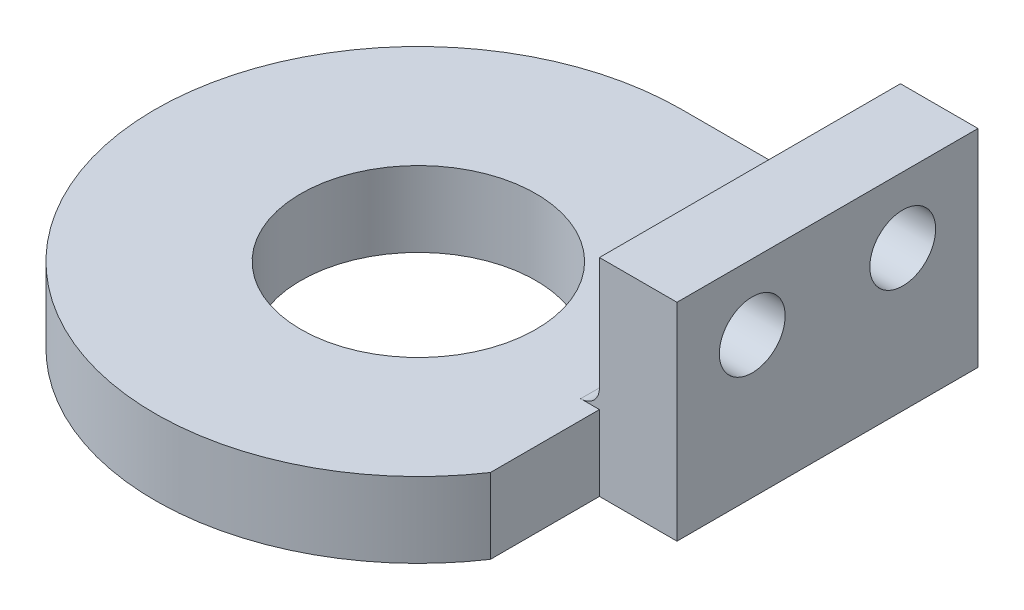
ISO-10303-21;
HEADER;
FILE_DESCRIPTION(('STEP AP214'),'2;1');
FILE_NAME('part.step','',(''),(''),'','','');
FILE_SCHEMA(('AUTOMOTIVE_DESIGN { 1 0 10303 214 1 1 1 1 }'));
ENDSEC;
DATA;
#1=APPLICATION_CONTEXT('core data for automotive mechanical design processes');
#2=APPLICATION_PROTOCOL_DEFINITION('international standard','automotive_design',2000,#1);
#3=PRODUCT_CONTEXT('',#1,'mechanical');
#4=PRODUCT('Part','Part','',(#3));
#5=PRODUCT_RELATED_PRODUCT_CATEGORY('part','',(#4));
#6=PRODUCT_DEFINITION_FORMATION('','',#4);
#7=PRODUCT_DEFINITION_CONTEXT('part definition',#1,'design');
#8=PRODUCT_DEFINITION('design','',#6,#7);
#9=PRODUCT_DEFINITION_SHAPE('','',#8);
#10=(LENGTH_UNIT() NAMED_UNIT(*) SI_UNIT(.MILLI.,.METRE.));
#11=(NAMED_UNIT(*) PLANE_ANGLE_UNIT() SI_UNIT($,.RADIAN.));
#12=(NAMED_UNIT(*) SI_UNIT($,.STERADIAN.) SOLID_ANGLE_UNIT());
#13=UNCERTAINTY_MEASURE_WITH_UNIT(LENGTH_MEASURE(1.E-05),#10,'distance_accuracy_value','');
#14=(GEOMETRIC_REPRESENTATION_CONTEXT(3) GLOBAL_UNCERTAINTY_ASSIGNED_CONTEXT((#13)) GLOBAL_UNIT_ASSIGNED_CONTEXT((#10,
#11,#12)) REPRESENTATION_CONTEXT('',''));
#15=CARTESIAN_POINT('',(0.,0.,0.));
#16=DIRECTION('',(0.,0.,1.));
#17=DIRECTION('',(1.,0.,0.));
#18=AXIS2_PLACEMENT_3D('',#15,#16,#17);
#19=CARTESIAN_POINT('',(0.,4.,0.));
#20=DIRECTION('',(0.,1.,0.));
#21=DIRECTION('',(0.,0.,1.));
#22=AXIS2_PLACEMENT_3D('',#19,#20,#21);
#23=PLANE('',#22);
#24=DIRECTION('',(0.,0.,-1.));
#25=VECTOR('',#24,1.);
#26=CARTESIAN_POINT('',(11.6283772182693,4.,2.00203526471364));
#27=LINE('',#26,#25);
#28=CARTESIAN_POINT('',(11.6283772182693,4.,7.79620697965594));
#29=VERTEX_POINT('',#28);
#30=CARTESIAN_POINT('',(11.6283772182693,4.,2.00203526471364));
#31=VERTEX_POINT('',#30);
#32=EDGE_CURVE('E140',#29,#31,#27,.T.);
#33=ORIENTED_EDGE('',*,*,#32,.T.);
#34=DIRECTION('',(-1.,0.,0.));
#35=VECTOR('',#34,1.);
#36=CARTESIAN_POINT('',(0.,4.,2.00203526471364));
#37=LINE('',#36,#35);
#38=CARTESIAN_POINT('',(10.6283772182693,4.,2.00203526471364));
#39=VERTEX_POINT('',#38);
#40=EDGE_CURVE('E48',#31,#39,#37,.T.);
#41=ORIENTED_EDGE('',*,*,#40,.T.);
#42=DIRECTION('',(0.,0.,1.));
#43=VECTOR('',#42,1.);
#44=CARTESIAN_POINT('',(10.6283772182693,4.,0.));
#45=LINE('',#44,#43);
#46=CARTESIAN_POINT('',(10.6283772182693,4.,-14.));
#47=VERTEX_POINT('',#46);
#48=EDGE_CURVE('E166',#39,#47,#45,.F.);
#49=ORIENTED_EDGE('',*,*,#48,.T.);
#50=DIRECTION('',(-1.,0.,0.));
#51=VECTOR('',#50,1.);
#52=CARTESIAN_POINT('',(0.,4.,-14.));
#53=LINE('',#52,#51);
#54=CARTESIAN_POINT('',(0.,4.,-14.));
#55=VERTEX_POINT('',#54);
#56=EDGE_CURVE('E142',#47,#55,#53,.T.);
#57=ORIENTED_EDGE('',*,*,#56,.T.);
#58=CARTESIAN_POINT('',(0.,4.,0.));
#59=DIRECTION('',(0.,1.,0.));
#60=DIRECTION('',(0.,0.,1.));
#61=AXIS2_PLACEMENT_3D('',#58,#59,#60);
#62=CIRCLE('',#61,14.);
#63=EDGE_CURVE('E145',#55,#29,#62,.T.);
#64=ORIENTED_EDGE('',*,*,#63,.T.);
#65=EDGE_LOOP('',(#33,#41,#49,#57,#64));
#66=FACE_BOUND('',#65,.T.);
#67=CARTESIAN_POINT('',(0.,4.,0.));
#68=DIRECTION('',(0.,1.,0.));
#69=DIRECTION('',(0.,0.,1.));
#70=AXIS2_PLACEMENT_3D('',#67,#68,#69);
#71=CIRCLE('',#70,6.25);
#72=CARTESIAN_POINT('',(0.,4.,6.25));
#73=VERTEX_POINT('',#72);
#74=EDGE_CURVE('E134',#73,#73,#71,.T.);
#75=ORIENTED_EDGE('',*,*,#74,.F.);
#76=EDGE_LOOP('',(#75));
#77=FACE_BOUND('',#76,.T.);
#78=ADVANCED_FACE('F33',(#66,#77),#23,.T.);
#79=CARTESIAN_POINT('',(0.,0.,0.));
#80=DIRECTION('',(0.,1.,0.));
#81=DIRECTION('',(0.,0.,1.));
#82=AXIS2_PLACEMENT_3D('',#79,#80,#81);
#83=PLANE('',#82);
#84=DIRECTION('',(0.,0.,-1.));
#85=VECTOR('',#84,1.);
#86=CARTESIAN_POINT('',(11.6283772182693,0.,2.00203526471364));
#87=LINE('',#86,#85);
#88=CARTESIAN_POINT('',(11.6283772182693,0.,7.79620697965594));
#89=VERTEX_POINT('',#88);
#90=CARTESIAN_POINT('',(11.6283772182693,0.,2.00203526471364));
#91=VERTEX_POINT('',#90);
#92=EDGE_CURVE('E137',#89,#91,#87,.T.);
#93=ORIENTED_EDGE('',*,*,#92,.F.);
#94=CARTESIAN_POINT('',(0.,0.,0.));
#95=DIRECTION('',(0.,1.,0.));
#96=DIRECTION('',(0.,0.,1.));
#97=AXIS2_PLACEMENT_3D('',#94,#95,#96);
#98=CIRCLE('',#97,14.);
#99=CARTESIAN_POINT('',(0.,0.,-14.));
#100=VERTEX_POINT('',#99);
#101=EDGE_CURVE('E143',#100,#89,#98,.T.);
#102=ORIENTED_EDGE('',*,*,#101,.F.);
#103=DIRECTION('',(-1.,0.,0.));
#104=VECTOR('',#103,1.);
#105=CARTESIAN_POINT('',(0.,0.,-14.));
#106=LINE('',#105,#104);
#107=CARTESIAN_POINT('',(15.7499982782653,0.,-14.));
#108=VERTEX_POINT('',#107);
#109=EDGE_CURVE('E153',#108,#100,#106,.T.);
#110=ORIENTED_EDGE('',*,*,#109,.F.);
#111=DIRECTION('',(0.,0.,-1.));
#112=VECTOR('',#111,1.);
#113=CARTESIAN_POINT('',(15.7499982782653,0.,-14.));
#114=LINE('',#113,#112);
#115=CARTESIAN_POINT('',(15.7499982782653,0.,2.00203526471364));
#116=VERTEX_POINT('',#115);
#117=EDGE_CURVE('E102',#116,#108,#114,.T.);
#118=ORIENTED_EDGE('',*,*,#117,.F.);
#119=DIRECTION('',(1.,0.,0.));
#120=VECTOR('',#119,1.);
#121=CARTESIAN_POINT('',(15.7499982782653,0.,2.00203526471364));
#122=LINE('',#121,#120);
#123=EDGE_CURVE('E150',#91,#116,#122,.T.);
#124=ORIENTED_EDGE('',*,*,#123,.F.);
#125=EDGE_LOOP('',(#93,#102,#110,#118,#124));
#126=FACE_BOUND('',#125,.T.);
#127=CARTESIAN_POINT('',(0.,0.,0.));
#128=DIRECTION('',(0.,1.,0.));
#129=DIRECTION('',(0.,0.,1.));
#130=AXIS2_PLACEMENT_3D('',#127,#128,#129);
#131=CIRCLE('',#130,6.25);
#132=CARTESIAN_POINT('',(0.,0.,6.25));
#133=VERTEX_POINT('',#132);
#134=EDGE_CURVE('E133',#133,#133,#131,.T.);
#135=ORIENTED_EDGE('',*,*,#134,.T.);
#136=EDGE_LOOP('',(#135));
#137=FACE_BOUND('',#136,.T.);
#138=ADVANCED_FACE('F184',(#126,#137),#83,.F.);
#139=CARTESIAN_POINT('',(11.6283772182693,4.,2.00203526471364));
#140=DIRECTION('',(-1.,0.,0.));
#141=DIRECTION('',(0.,0.,1.));
#142=AXIS2_PLACEMENT_3D('',#139,#140,#141);
#143=PLANE('',#142);
#144=ORIENTED_EDGE('',*,*,#92,.T.);
#145=DIRECTION('',(0.,-1.,0.));
#146=VECTOR('',#145,1.);
#147=CARTESIAN_POINT('',(11.6283772182693,4.,2.00203526471364));
#148=LINE('',#147,#146);
#149=EDGE_CURVE('E161',#31,#91,#148,.T.);
#150=ORIENTED_EDGE('',*,*,#149,.F.);
#151=ORIENTED_EDGE('',*,*,#32,.F.);
#152=DIRECTION('',(0.,-1.,0.));
#153=VECTOR('',#152,1.);
#154=CARTESIAN_POINT('',(11.6283772182693,4.,7.79620697965594));
#155=LINE('',#154,#153);
#156=EDGE_CURVE('E147',#29,#89,#155,.T.);
#157=ORIENTED_EDGE('',*,*,#156,.T.);
#158=EDGE_LOOP('',(#144,#150,#151,#157));
#159=FACE_BOUND('',#158,.T.);
#160=ADVANCED_FACE('F192',(#159),#143,.F.);
#161=CARTESIAN_POINT('',(15.7499982782653,4.,2.00203526471364));
#162=DIRECTION('',(0.,0.,-1.));
#163=DIRECTION('',(-1.,0.,0.));
#164=AXIS2_PLACEMENT_3D('',#161,#162,#163);
#165=PLANE('',#164);
#166=ORIENTED_EDGE('',*,*,#123,.T.);
#167=DIRECTION('',(0.,-1.,0.));
#168=VECTOR('',#167,1.);
#169=CARTESIAN_POINT('',(15.7499982782653,4.,2.00203526471364));
#170=LINE('',#169,#168);
#171=CARTESIAN_POINT('',(15.7499982782653,11.,2.00203526471364));
#172=VERTEX_POINT('',#171);
#173=EDGE_CURVE('E105',#172,#116,#170,.T.);
#174=ORIENTED_EDGE('',*,*,#173,.F.);
#175=DIRECTION('',(1.,0.,0.));
#176=VECTOR('',#175,1.);
#177=CARTESIAN_POINT('',(15.7499982782653,11.,2.00203526471364));
#178=LINE('',#177,#176);
#179=CARTESIAN_POINT('',(11.6283772182693,11.,2.00203526471364));
#180=VERTEX_POINT('',#179);
#181=EDGE_CURVE('E120',#180,#172,#178,.T.);
#182=ORIENTED_EDGE('',*,*,#181,.F.);
#183=DIRECTION('',(0.,-1.,0.));
#184=VECTOR('',#183,1.);
#185=CARTESIAN_POINT('',(11.6283772182693,11.,2.00203526471364));
#186=LINE('',#185,#184);
#187=CARTESIAN_POINT('',(11.6283772182693,5.,2.00203526471364));
#188=VERTEX_POINT('',#187);
#189=EDGE_CURVE('E130',#180,#188,#186,.T.);
#190=ORIENTED_EDGE('',*,*,#189,.T.);
#191=CARTESIAN_POINT('',(10.6283772182693,5.,2.00203526471364));
#192=DIRECTION('',(0.,0.,-1.));
#193=DIRECTION('',(-1.,0.,0.));
#194=AXIS2_PLACEMENT_3D('',#191,#192,#193);
#195=CIRCLE('',#194,1.);
#196=EDGE_CURVE('E41',#188,#39,#195,.T.);
#197=ORIENTED_EDGE('',*,*,#196,.T.);
#198=ORIENTED_EDGE('',*,*,#40,.F.);
#199=ORIENTED_EDGE('',*,*,#149,.T.);
#200=EDGE_LOOP('',(#166,#174,#182,#190,#197,#198,#199));
#201=FACE_BOUND('',#200,.T.);
#202=ADVANCED_FACE('F181',(#201),#165,.F.);
#203=CARTESIAN_POINT('',(15.7499982782653,4.,-14.));
#204=DIRECTION('',(-1.,0.,0.));
#205=DIRECTION('',(0.,0.,1.));
#206=AXIS2_PLACEMENT_3D('',#203,#204,#205);
#207=PLANE('',#206);
#208=CARTESIAN_POINT('',(15.7499982782653,7.5,-9.99898236764318));
#209=DIRECTION('',(-1.,0.,0.));
#210=DIRECTION('',(0.,0.,1.));
#211=AXIS2_PLACEMENT_3D('',#208,#209,#210);
#212=CIRCLE('',#211,1.75);
#213=CARTESIAN_POINT('',(15.7499982782653,7.5,-8.24898236764318));
#214=VERTEX_POINT('',#213);
#215=EDGE_CURVE('E219',#214,#214,#212,.T.);
#216=ORIENTED_EDGE('',*,*,#215,.T.);
#217=EDGE_LOOP('',(#216));
#218=FACE_BOUND('',#217,.T.);
#219=CARTESIAN_POINT('',(15.7499982782653,7.5,-1.99898236764318));
#220=DIRECTION('',(-1.,0.,0.));
#221=DIRECTION('',(0.,0.,1.));
#222=AXIS2_PLACEMENT_3D('',#219,#220,#221);
#223=CIRCLE('',#222,1.75);
#224=CARTESIAN_POINT('',(15.7499982782653,7.5,-0.248982367643181));
#225=VERTEX_POINT('',#224);
#226=EDGE_CURVE('E121',#225,#225,#223,.T.);
#227=ORIENTED_EDGE('',*,*,#226,.T.);
#228=EDGE_LOOP('',(#227));
#229=FACE_BOUND('',#228,.T.);
#230=ORIENTED_EDGE('',*,*,#117,.T.);
#231=DIRECTION('',(0.,-1.,0.));
#232=VECTOR('',#231,1.);
#233=CARTESIAN_POINT('',(15.7499982782653,4.,-14.));
#234=LINE('',#233,#232);
#235=CARTESIAN_POINT('',(15.7499982782653,11.,-14.));
#236=VERTEX_POINT('',#235);
#237=EDGE_CURVE('E95',#236,#108,#234,.T.);
#238=ORIENTED_EDGE('',*,*,#237,.F.);
#239=DIRECTION('',(0.,0.,-1.));
#240=VECTOR('',#239,1.);
#241=CARTESIAN_POINT('',(15.7499982782653,11.,-14.));
#242=LINE('',#241,#240);
#243=EDGE_CURVE('E100',#172,#236,#242,.T.);
#244=ORIENTED_EDGE('',*,*,#243,.F.);
#245=ORIENTED_EDGE('',*,*,#173,.T.);
#246=EDGE_LOOP('',(#230,#238,#244,#245));
#247=FACE_BOUND('',#246,.T.);
#248=ADVANCED_FACE('F97',(#218,#229,#247),#207,.F.);
#249=CARTESIAN_POINT('',(0.,4.,-14.));
#250=DIRECTION('',(0.,0.,1.));
#251=DIRECTION('',(1.,0.,0.));
#252=AXIS2_PLACEMENT_3D('',#249,#250,#251);
#253=PLANE('',#252);
#254=ORIENTED_EDGE('',*,*,#109,.T.);
#255=DIRECTION('',(0.,-1.,0.));
#256=VECTOR('',#255,1.);
#257=CARTESIAN_POINT('',(0.,4.,-14.));
#258=LINE('',#257,#256);
#259=EDGE_CURVE('E106',#55,#100,#258,.T.);
#260=ORIENTED_EDGE('',*,*,#259,.F.);
#261=ORIENTED_EDGE('',*,*,#56,.F.);
#262=CARTESIAN_POINT('',(10.6283772182693,5.,-14.));
#263=DIRECTION('',(0.,0.,1.));
#264=DIRECTION('',(1.,0.,0.));
#265=AXIS2_PLACEMENT_3D('',#262,#263,#264);
#266=CIRCLE('',#265,1.);
#267=CARTESIAN_POINT('',(11.6283772182693,5.,-14.));
#268=VERTEX_POINT('',#267);
#269=EDGE_CURVE('E11',#47,#268,#266,.T.);
#270=ORIENTED_EDGE('',*,*,#269,.T.);
#271=DIRECTION('',(0.,-1.,0.));
#272=VECTOR('',#271,1.);
#273=CARTESIAN_POINT('',(11.6283772182693,11.,-14.));
#274=LINE('',#273,#272);
#275=CARTESIAN_POINT('',(11.6283772182693,11.,-14.));
#276=VERTEX_POINT('',#275);
#277=EDGE_CURVE('E112',#276,#268,#274,.T.);
#278=ORIENTED_EDGE('',*,*,#277,.F.);
#279=DIRECTION('',(-1.,0.,0.));
#280=VECTOR('',#279,1.);
#281=CARTESIAN_POINT('',(15.7499982782653,11.,-14.));
#282=LINE('',#281,#280);
#283=EDGE_CURVE('E109',#236,#276,#282,.T.);
#284=ORIENTED_EDGE('',*,*,#283,.F.);
#285=ORIENTED_EDGE('',*,*,#237,.T.);
#286=EDGE_LOOP('',(#254,#260,#261,#270,#278,#284,#285));
#287=FACE_BOUND('',#286,.T.);
#288=ADVANCED_FACE('F110',(#287),#253,.F.);
#289=CARTESIAN_POINT('',(0.,4.,0.));
#290=DIRECTION('',(0.,-1.,0.));
#291=DIRECTION('',(0.,0.,-1.));
#292=AXIS2_PLACEMENT_3D('',#289,#290,#291);
#293=CYLINDRICAL_SURFACE('',#292,14.);
#294=ORIENTED_EDGE('',*,*,#101,.T.);
#295=ORIENTED_EDGE('',*,*,#156,.F.);
#296=ORIENTED_EDGE('',*,*,#63,.F.);
#297=ORIENTED_EDGE('',*,*,#259,.T.);
#298=EDGE_LOOP('',(#294,#295,#296,#297));
#299=FACE_BOUND('',#298,.T.);
#300=ADVANCED_FACE('F189',(#299),#293,.T.);
#301=CARTESIAN_POINT('',(0.,4.,0.));
#302=DIRECTION('',(0.,-1.,0.));
#303=DIRECTION('',(0.,0.,-1.));
#304=AXIS2_PLACEMENT_3D('',#301,#302,#303);
#305=CYLINDRICAL_SURFACE('',#304,6.25);
#306=ORIENTED_EDGE('',*,*,#74,.T.);
#307=EDGE_LOOP('',(#306));
#308=FACE_BOUND('',#307,.T.);
#309=ORIENTED_EDGE('',*,*,#134,.F.);
#310=EDGE_LOOP('',(#309));
#311=FACE_BOUND('',#310,.T.);
#312=ADVANCED_FACE('F205',(#308,#311),#305,.F.);
#313=CARTESIAN_POINT('',(11.6283772182693,11.,-14.));
#314=DIRECTION('',(1.,0.,0.));
#315=DIRECTION('',(0.,0.,-1.));
#316=AXIS2_PLACEMENT_3D('',#313,#314,#315);
#317=PLANE('',#316);
#318=CARTESIAN_POINT('',(11.6283772182693,7.5,-9.99898236764318));
#319=DIRECTION('',(-1.,0.,0.));
#320=DIRECTION('',(0.,0.,1.));
#321=AXIS2_PLACEMENT_3D('',#318,#319,#320);
#322=CIRCLE('',#321,1.75);
#323=CARTESIAN_POINT('',(11.6283772182693,7.5,-8.24898236764318));
#324=VERTEX_POINT('',#323);
#325=EDGE_CURVE('E230',#324,#324,#322,.T.);
#326=ORIENTED_EDGE('',*,*,#325,.F.);
#327=EDGE_LOOP('',(#326));
#328=FACE_BOUND('',#327,.T.);
#329=CARTESIAN_POINT('',(11.6283772182693,7.5,-1.99898236764318));
#330=DIRECTION('',(-1.,0.,0.));
#331=DIRECTION('',(0.,0.,1.));
#332=AXIS2_PLACEMENT_3D('',#329,#330,#331);
#333=CIRCLE('',#332,1.75);
#334=CARTESIAN_POINT('',(11.6283772182693,7.5,-0.248982367643181));
#335=VERTEX_POINT('',#334);
#336=EDGE_CURVE('E124',#335,#335,#333,.T.);
#337=ORIENTED_EDGE('',*,*,#336,.F.);
#338=EDGE_LOOP('',(#337));
#339=FACE_BOUND('',#338,.T.);
#340=ORIENTED_EDGE('',*,*,#277,.T.);
#341=DIRECTION('',(0.,0.,1.));
#342=VECTOR('',#341,1.);
#343=CARTESIAN_POINT('',(11.6283772182693,5.,-14.));
#344=LINE('',#343,#342);
#345=EDGE_CURVE('E163',#268,#188,#344,.T.);
#346=ORIENTED_EDGE('',*,*,#345,.T.);
#347=ORIENTED_EDGE('',*,*,#189,.F.);
#348=DIRECTION('',(0.,0.,1.));
#349=VECTOR('',#348,1.);
#350=CARTESIAN_POINT('',(11.6283772182693,11.,-14.));
#351=LINE('',#350,#349);
#352=EDGE_CURVE('E115',#276,#180,#351,.T.);
#353=ORIENTED_EDGE('',*,*,#352,.F.);
#354=EDGE_LOOP('',(#340,#346,#347,#353));
#355=FACE_BOUND('',#354,.T.);
#356=ADVANCED_FACE('F179',(#328,#339,#355),#317,.F.);
#357=CARTESIAN_POINT('',(0.,11.,0.));
#358=DIRECTION('',(0.,-1.,0.));
#359=DIRECTION('',(0.,0.,-1.));
#360=AXIS2_PLACEMENT_3D('',#357,#358,#359);
#361=PLANE('',#360);
#362=ORIENTED_EDGE('',*,*,#243,.T.);
#363=ORIENTED_EDGE('',*,*,#283,.T.);
#364=ORIENTED_EDGE('',*,*,#352,.T.);
#365=ORIENTED_EDGE('',*,*,#181,.T.);
#366=EDGE_LOOP('',(#362,#363,#364,#365));
#367=FACE_BOUND('',#366,.T.);
#368=ADVANCED_FACE('F118',(#367),#361,.F.);
#369=CARTESIAN_POINT('',(15.7499982782653,7.5,-1.99898236764318));
#370=DIRECTION('',(-1.,0.,0.));
#371=DIRECTION('',(0.,0.,1.));
#372=AXIS2_PLACEMENT_3D('',#369,#370,#371);
#373=CYLINDRICAL_SURFACE('',#372,1.75);
#374=ORIENTED_EDGE('',*,*,#226,.F.);
#375=EDGE_LOOP('',(#374));
#376=FACE_BOUND('',#375,.T.);
#377=ORIENTED_EDGE('',*,*,#336,.T.);
#378=EDGE_LOOP('',(#377));
#379=FACE_BOUND('',#378,.T.);
#380=ADVANCED_FACE('F222',(#376,#379),#373,.F.);
#381=CARTESIAN_POINT('',(15.7499982782653,7.5,-9.99898236764318));
#382=DIRECTION('',(-1.,0.,0.));
#383=DIRECTION('',(0.,0.,1.));
#384=AXIS2_PLACEMENT_3D('',#381,#382,#383);
#385=CYLINDRICAL_SURFACE('',#384,1.75);
#386=ORIENTED_EDGE('',*,*,#215,.F.);
#387=EDGE_LOOP('',(#386));
#388=FACE_BOUND('',#387,.T.);
#389=ORIENTED_EDGE('',*,*,#325,.T.);
#390=EDGE_LOOP('',(#389));
#391=FACE_BOUND('',#390,.T.);
#392=ADVANCED_FACE('F225',(#388,#391),#385,.F.);
#393=CARTESIAN_POINT('',(10.6283772182693,5.,-14.));
#394=DIRECTION('',(0.,0.,1.));
#395=DIRECTION('',(1.,0.,0.));
#396=AXIS2_PLACEMENT_3D('',#393,#394,#395);
#397=CYLINDRICAL_SURFACE('',#396,1.);
#398=ORIENTED_EDGE('',*,*,#269,.F.);
#399=ORIENTED_EDGE('',*,*,#48,.F.);
#400=ORIENTED_EDGE('',*,*,#196,.F.);
#401=ORIENTED_EDGE('',*,*,#345,.F.);
#402=EDGE_LOOP('',(#398,#399,#400,#401));
#403=FACE_BOUND('',#402,.T.);
#404=ADVANCED_FACE('F35',(#403),#397,.F.);
#405=CLOSED_SHELL('',(#78,#138,#160,#202,#248,#288,#300,#312,#356,#368,#380,#392,#404));
#406=MANIFOLD_SOLID_BREP('B2',#405);
#407=ADVANCED_BREP_SHAPE_REPRESENTATION('',(#18,#406),#14);
#408=SHAPE_DEFINITION_REPRESENTATION(#9,#407);
ENDSEC;
END-ISO-10303-21;
